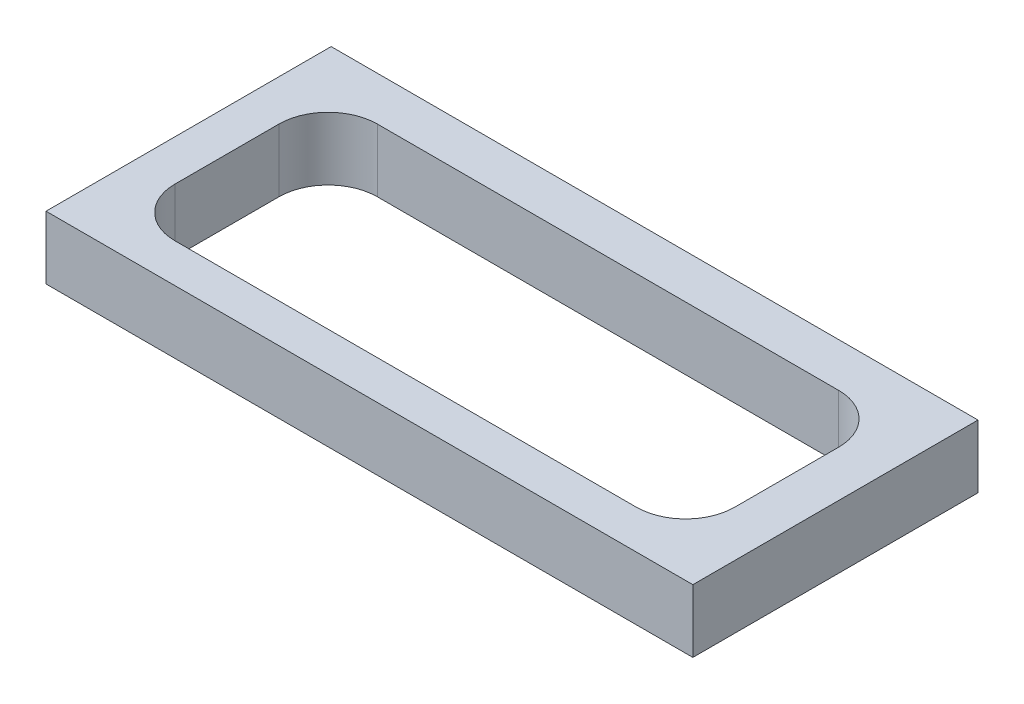
ISO-10303-21;
HEADER;
FILE_DESCRIPTION(('STEP AP214'),'2;1');
FILE_NAME('part.step','',(''),(''),'','','');
FILE_SCHEMA(('AUTOMOTIVE_DESIGN { 1 0 10303 214 1 1 1 1 }'));
ENDSEC;
DATA;
#1=APPLICATION_CONTEXT('core data for automotive mechanical design processes');
#2=APPLICATION_PROTOCOL_DEFINITION('international standard','automotive_design',2000,#1);
#3=PRODUCT_CONTEXT('',#1,'mechanical');
#4=PRODUCT('Part','Part','',(#3));
#5=PRODUCT_RELATED_PRODUCT_CATEGORY('part','',(#4));
#6=PRODUCT_DEFINITION_FORMATION('','',#4);
#7=PRODUCT_DEFINITION_CONTEXT('part definition',#1,'design');
#8=PRODUCT_DEFINITION('design','',#6,#7);
#9=PRODUCT_DEFINITION_SHAPE('','',#8);
#10=(LENGTH_UNIT() NAMED_UNIT(*) SI_UNIT(.MILLI.,.METRE.));
#11=(NAMED_UNIT(*) PLANE_ANGLE_UNIT() SI_UNIT($,.RADIAN.));
#12=(NAMED_UNIT(*) SI_UNIT($,.STERADIAN.) SOLID_ANGLE_UNIT());
#13=UNCERTAINTY_MEASURE_WITH_UNIT(LENGTH_MEASURE(1.E-05),#10,'distance_accuracy_value','');
#14=(GEOMETRIC_REPRESENTATION_CONTEXT(3) GLOBAL_UNCERTAINTY_ASSIGNED_CONTEXT((#13)) GLOBAL_UNIT_ASSIGNED_CONTEXT((#10,
#11,#12)) REPRESENTATION_CONTEXT('',''));
#15=CARTESIAN_POINT('',(0.,0.,0.));
#16=DIRECTION('',(0.,0.,1.));
#17=DIRECTION('',(1.,0.,0.));
#18=AXIS2_PLACEMENT_3D('',#15,#16,#17);
#19=CARTESIAN_POINT('',(0.,5.,0.));
#20=DIRECTION('',(0.,1.,0.));
#21=DIRECTION('',(0.,0.,1.));
#22=AXIS2_PLACEMENT_3D('',#19,#20,#21);
#23=PLANE('',#22);
#24=DIRECTION('',(0.,0.,1.));
#25=VECTOR('',#24,1.);
#26=CARTESIAN_POINT('',(-3.25088664137556,5.,-3.48837450157463));
#27=LINE('',#26,#25);
#28=CARTESIAN_POINT('',(-3.25088664137556,5.,-3.48837450157463));
#29=VERTEX_POINT('',#28);
#30=CARTESIAN_POINT('',(-3.25088664137556,5.,19.1312504378826));
#31=VERTEX_POINT('',#30);
#32=EDGE_CURVE('E194',#29,#31,#27,.T.);
#33=ORIENTED_EDGE('',*,*,#32,.T.);
#34=DIRECTION('',(1.,0.,0.));
#35=VECTOR('',#34,1.);
#36=CARTESIAN_POINT('',(-3.25088664137556,5.,19.1312504378826));
#37=LINE('',#36,#35);
#38=CARTESIAN_POINT('',(48.0616375085042,5.,19.1312504378826));
#39=VERTEX_POINT('',#38);
#40=EDGE_CURVE('E197',#31,#39,#37,.T.);
#41=ORIENTED_EDGE('',*,*,#40,.T.);
#42=DIRECTION('',(0.,0.,-1.));
#43=VECTOR('',#42,1.);
#44=CARTESIAN_POINT('',(48.0616375085042,5.,-3.48837450157463));
#45=LINE('',#44,#43);
#46=CARTESIAN_POINT('',(48.0616375085042,5.,-3.48837450157463));
#47=VERTEX_POINT('',#46);
#48=EDGE_CURVE('E196',#39,#47,#45,.T.);
#49=ORIENTED_EDGE('',*,*,#48,.T.);
#50=DIRECTION('',(-1.,0.,0.));
#51=VECTOR('',#50,1.);
#52=CARTESIAN_POINT('',(-3.25088664137556,5.,-3.48837450157463));
#53=LINE('',#52,#51);
#54=EDGE_CURVE('E202',#47,#29,#53,.T.);
#55=ORIENTED_EDGE('',*,*,#54,.T.);
#56=EDGE_LOOP('',(#33,#41,#49,#55));
#57=FACE_BOUND('',#56,.T.);
#58=DIRECTION('',(-1.,0.,0.));
#59=VECTOR('',#58,1.);
#60=CARTESIAN_POINT('',(3.9,5.,0.));
#61=LINE('',#60,#59);
#62=CARTESIAN_POINT('',(40.5,5.,0.));
#63=VERTEX_POINT('',#62);
#64=CARTESIAN_POINT('',(3.9,5.,0.));
#65=VERTEX_POINT('',#64);
#66=EDGE_CURVE('E136',#63,#65,#61,.T.);
#67=ORIENTED_EDGE('',*,*,#66,.F.);
#68=CARTESIAN_POINT('',(40.5,5.,3.9));
#69=DIRECTION('',(0.,1.,0.));
#70=DIRECTION('',(0.,0.,-1.));
#71=AXIS2_PLACEMENT_3D('',#68,#69,#70);
#72=CIRCLE('',#71,3.9);
#73=CARTESIAN_POINT('',(44.4,5.,3.9));
#74=VERTEX_POINT('',#73);
#75=EDGE_CURVE('E126',#74,#63,#72,.T.);
#76=ORIENTED_EDGE('',*,*,#75,.F.);
#77=DIRECTION('',(0.,0.,-1.));
#78=VECTOR('',#77,1.);
#79=CARTESIAN_POINT('',(44.4,5.,3.9));
#80=LINE('',#79,#78);
#81=CARTESIAN_POINT('',(44.4,5.,12.15));
#82=VERTEX_POINT('',#81);
#83=EDGE_CURVE('E162',#82,#74,#80,.T.);
#84=ORIENTED_EDGE('',*,*,#83,.F.);
#85=CARTESIAN_POINT('',(40.5,5.,12.15));
#86=DIRECTION('',(0.,1.,0.));
#87=DIRECTION('',(0.,0.,1.));
#88=AXIS2_PLACEMENT_3D('',#85,#86,#87);
#89=CIRCLE('',#88,3.9);
#90=CARTESIAN_POINT('',(40.5,5.,16.05));
#91=VERTEX_POINT('',#90);
#92=EDGE_CURVE('E159',#91,#82,#89,.T.);
#93=ORIENTED_EDGE('',*,*,#92,.F.);
#94=DIRECTION('',(1.,0.,0.));
#95=VECTOR('',#94,1.);
#96=CARTESIAN_POINT('',(3.9,5.,16.05));
#97=LINE('',#96,#95);
#98=CARTESIAN_POINT('',(3.9,5.,16.05));
#99=VERTEX_POINT('',#98);
#100=EDGE_CURVE('E160',#99,#91,#97,.T.);
#101=ORIENTED_EDGE('',*,*,#100,.F.);
#102=CARTESIAN_POINT('',(3.9,5.,12.15));
#103=DIRECTION('',(0.,1.,0.));
#104=DIRECTION('',(0.,0.,1.));
#105=AXIS2_PLACEMENT_3D('',#102,#103,#104);
#106=CIRCLE('',#105,3.9);
#107=CARTESIAN_POINT('',(0.,5.,12.15));
#108=VERTEX_POINT('',#107);
#109=EDGE_CURVE('E153',#108,#99,#106,.T.);
#110=ORIENTED_EDGE('',*,*,#109,.F.);
#111=DIRECTION('',(0.,0.,1.));
#112=VECTOR('',#111,1.);
#113=CARTESIAN_POINT('',(0.,5.,3.9));
#114=LINE('',#113,#112);
#115=CARTESIAN_POINT('',(0.,5.,3.9));
#116=VERTEX_POINT('',#115);
#117=EDGE_CURVE('E152',#116,#108,#114,.T.);
#118=ORIENTED_EDGE('',*,*,#117,.F.);
#119=CARTESIAN_POINT('',(3.9,5.,3.9));
#120=DIRECTION('',(0.,1.,0.));
#121=DIRECTION('',(0.,0.,1.));
#122=AXIS2_PLACEMENT_3D('',#119,#120,#121);
#123=CIRCLE('',#122,3.9);
#124=EDGE_CURVE('E146',#65,#116,#123,.T.);
#125=ORIENTED_EDGE('',*,*,#124,.F.);
#126=EDGE_LOOP('',(#67,#76,#84,#93,#101,#110,#118,#125));
#127=FACE_BOUND('',#126,.T.);
#128=ADVANCED_FACE('F39',(#57,#127),#23,.T.);
#129=CARTESIAN_POINT('',(0.,0.,0.));
#130=DIRECTION('',(0.,1.,0.));
#131=DIRECTION('',(0.,0.,1.));
#132=AXIS2_PLACEMENT_3D('',#129,#130,#131);
#133=PLANE('',#132);
#134=DIRECTION('',(0.,0.,1.));
#135=VECTOR('',#134,1.);
#136=CARTESIAN_POINT('',(-3.25088664137556,0.,-3.48837450157463));
#137=LINE('',#136,#135);
#138=CARTESIAN_POINT('',(-3.25088664137556,0.,-3.48837450157463));
#139=VERTEX_POINT('',#138);
#140=CARTESIAN_POINT('',(-3.25088664137556,0.,19.1312504378826));
#141=VERTEX_POINT('',#140);
#142=EDGE_CURVE('E143',#139,#141,#137,.T.);
#143=ORIENTED_EDGE('',*,*,#142,.F.);
#144=DIRECTION('',(-1.,0.,0.));
#145=VECTOR('',#144,1.);
#146=CARTESIAN_POINT('',(-3.25088664137556,0.,-3.48837450157463));
#147=LINE('',#146,#145);
#148=CARTESIAN_POINT('',(48.0616375085042,0.,-3.48837450157463));
#149=VERTEX_POINT('',#148);
#150=EDGE_CURVE('E199',#149,#139,#147,.T.);
#151=ORIENTED_EDGE('',*,*,#150,.F.);
#152=DIRECTION('',(0.,0.,-1.));
#153=VECTOR('',#152,1.);
#154=CARTESIAN_POINT('',(48.0616375085042,0.,-3.48837450157463));
#155=LINE('',#154,#153);
#156=CARTESIAN_POINT('',(48.0616375085042,0.,19.1312504378826));
#157=VERTEX_POINT('',#156);
#158=EDGE_CURVE('E210',#157,#149,#155,.T.);
#159=ORIENTED_EDGE('',*,*,#158,.F.);
#160=DIRECTION('',(1.,0.,0.));
#161=VECTOR('',#160,1.);
#162=CARTESIAN_POINT('',(-3.25088664137556,0.,19.1312504378826));
#163=LINE('',#162,#161);
#164=EDGE_CURVE('E207',#141,#157,#163,.T.);
#165=ORIENTED_EDGE('',*,*,#164,.F.);
#166=EDGE_LOOP('',(#143,#151,#159,#165));
#167=FACE_BOUND('',#166,.T.);
#168=CARTESIAN_POINT('',(40.5,0.,3.9));
#169=DIRECTION('',(0.,1.,0.));
#170=DIRECTION('',(0.,0.,-1.));
#171=AXIS2_PLACEMENT_3D('',#168,#169,#170);
#172=CIRCLE('',#171,3.9);
#173=CARTESIAN_POINT('',(44.4,0.,3.9));
#174=VERTEX_POINT('',#173);
#175=CARTESIAN_POINT('',(40.5,0.,0.));
#176=VERTEX_POINT('',#175);
#177=EDGE_CURVE('E64',#174,#176,#172,.T.);
#178=ORIENTED_EDGE('',*,*,#177,.T.);
#179=DIRECTION('',(-1.,0.,0.));
#180=VECTOR('',#179,1.);
#181=CARTESIAN_POINT('',(3.9,0.,0.));
#182=LINE('',#181,#180);
#183=CARTESIAN_POINT('',(3.9,0.,0.));
#184=VERTEX_POINT('',#183);
#185=EDGE_CURVE('E142',#176,#184,#182,.T.);
#186=ORIENTED_EDGE('',*,*,#185,.T.);
#187=CARTESIAN_POINT('',(3.9,0.,3.9));
#188=DIRECTION('',(0.,1.,0.));
#189=DIRECTION('',(0.,0.,1.));
#190=AXIS2_PLACEMENT_3D('',#187,#188,#189);
#191=CIRCLE('',#190,3.9);
#192=CARTESIAN_POINT('',(0.,0.,3.9));
#193=VERTEX_POINT('',#192);
#194=EDGE_CURVE('E163',#184,#193,#191,.T.);
#195=ORIENTED_EDGE('',*,*,#194,.T.);
#196=DIRECTION('',(0.,0.,1.));
#197=VECTOR('',#196,1.);
#198=CARTESIAN_POINT('',(0.,0.,3.9));
#199=LINE('',#198,#197);
#200=CARTESIAN_POINT('',(0.,0.,12.15));
#201=VERTEX_POINT('',#200);
#202=EDGE_CURVE('E166',#193,#201,#199,.T.);
#203=ORIENTED_EDGE('',*,*,#202,.T.);
#204=CARTESIAN_POINT('',(3.9,0.,12.15));
#205=DIRECTION('',(0.,1.,0.));
#206=DIRECTION('',(0.,0.,1.));
#207=AXIS2_PLACEMENT_3D('',#204,#205,#206);
#208=CIRCLE('',#207,3.9);
#209=CARTESIAN_POINT('',(3.9,0.,16.05));
#210=VERTEX_POINT('',#209);
#211=EDGE_CURVE('E173',#201,#210,#208,.T.);
#212=ORIENTED_EDGE('',*,*,#211,.T.);
#213=DIRECTION('',(1.,0.,0.));
#214=VECTOR('',#213,1.);
#215=CARTESIAN_POINT('',(3.9,0.,16.05));
#216=LINE('',#215,#214);
#217=CARTESIAN_POINT('',(40.5,0.,16.05));
#218=VERTEX_POINT('',#217);
#219=EDGE_CURVE('E174',#210,#218,#216,.T.);
#220=ORIENTED_EDGE('',*,*,#219,.T.);
#221=CARTESIAN_POINT('',(40.5,0.,12.15));
#222=DIRECTION('',(0.,1.,0.));
#223=DIRECTION('',(0.,0.,1.));
#224=AXIS2_PLACEMENT_3D('',#221,#222,#223);
#225=CIRCLE('',#224,3.9);
#226=CARTESIAN_POINT('',(44.4,0.,12.15));
#227=VERTEX_POINT('',#226);
#228=EDGE_CURVE('E180',#218,#227,#225,.T.);
#229=ORIENTED_EDGE('',*,*,#228,.T.);
#230=DIRECTION('',(0.,0.,-1.));
#231=VECTOR('',#230,1.);
#232=CARTESIAN_POINT('',(44.4,0.,3.9));
#233=LINE('',#232,#231);
#234=EDGE_CURVE('E140',#227,#174,#233,.T.);
#235=ORIENTED_EDGE('',*,*,#234,.T.);
#236=EDGE_LOOP('',(#178,#186,#195,#203,#212,#220,#229,#235));
#237=FACE_BOUND('',#236,.T.);
#238=ADVANCED_FACE('F226',(#167,#237),#133,.F.);
#239=CARTESIAN_POINT('',(-3.25088664137556,5.,-3.48837450157463));
#240=DIRECTION('',(1.,0.,0.));
#241=DIRECTION('',(0.,0.,-1.));
#242=AXIS2_PLACEMENT_3D('',#239,#240,#241);
#243=PLANE('',#242);
#244=ORIENTED_EDGE('',*,*,#142,.T.);
#245=DIRECTION('',(0.,-1.,0.));
#246=VECTOR('',#245,1.);
#247=CARTESIAN_POINT('',(-3.25088664137556,5.,19.1312504378826));
#248=LINE('',#247,#246);
#249=EDGE_CURVE('E11',#31,#141,#248,.T.);
#250=ORIENTED_EDGE('',*,*,#249,.F.);
#251=ORIENTED_EDGE('',*,*,#32,.F.);
#252=DIRECTION('',(0.,-1.,0.));
#253=VECTOR('',#252,1.);
#254=CARTESIAN_POINT('',(-3.25088664137556,5.,-3.48837450157463));
#255=LINE('',#254,#253);
#256=EDGE_CURVE('E201',#29,#139,#255,.T.);
#257=ORIENTED_EDGE('',*,*,#256,.T.);
#258=EDGE_LOOP('',(#244,#250,#251,#257));
#259=FACE_BOUND('',#258,.T.);
#260=ADVANCED_FACE('F41',(#259),#243,.F.);
#261=CARTESIAN_POINT('',(-3.25088664137556,5.,19.1312504378826));
#262=DIRECTION('',(0.,0.,-1.));
#263=DIRECTION('',(-1.,0.,0.));
#264=AXIS2_PLACEMENT_3D('',#261,#262,#263);
#265=PLANE('',#264);
#266=ORIENTED_EDGE('',*,*,#164,.T.);
#267=DIRECTION('',(0.,-1.,0.));
#268=VECTOR('',#267,1.);
#269=CARTESIAN_POINT('',(48.0616375085042,5.,19.1312504378826));
#270=LINE('',#269,#268);
#271=EDGE_CURVE('E50',#39,#157,#270,.T.);
#272=ORIENTED_EDGE('',*,*,#271,.F.);
#273=ORIENTED_EDGE('',*,*,#40,.F.);
#274=ORIENTED_EDGE('',*,*,#249,.T.);
#275=EDGE_LOOP('',(#266,#272,#273,#274));
#276=FACE_BOUND('',#275,.T.);
#277=ADVANCED_FACE('F237',(#276),#265,.F.);
#278=CARTESIAN_POINT('',(48.0616375085042,5.,-3.48837450157463));
#279=DIRECTION('',(-1.,0.,0.));
#280=DIRECTION('',(0.,0.,1.));
#281=AXIS2_PLACEMENT_3D('',#278,#279,#280);
#282=PLANE('',#281);
#283=ORIENTED_EDGE('',*,*,#158,.T.);
#284=DIRECTION('',(0.,-1.,0.));
#285=VECTOR('',#284,1.);
#286=CARTESIAN_POINT('',(48.0616375085042,5.,-3.48837450157463));
#287=LINE('',#286,#285);
#288=EDGE_CURVE('E211',#47,#149,#287,.T.);
#289=ORIENTED_EDGE('',*,*,#288,.F.);
#290=ORIENTED_EDGE('',*,*,#48,.F.);
#291=ORIENTED_EDGE('',*,*,#271,.T.);
#292=EDGE_LOOP('',(#283,#289,#290,#291));
#293=FACE_BOUND('',#292,.T.);
#294=ADVANCED_FACE('F217',(#293),#282,.F.);
#295=CARTESIAN_POINT('',(-3.25088664137556,5.,-3.48837450157463));
#296=DIRECTION('',(0.,0.,1.));
#297=DIRECTION('',(1.,0.,0.));
#298=AXIS2_PLACEMENT_3D('',#295,#296,#297);
#299=PLANE('',#298);
#300=ORIENTED_EDGE('',*,*,#150,.T.);
#301=ORIENTED_EDGE('',*,*,#256,.F.);
#302=ORIENTED_EDGE('',*,*,#54,.F.);
#303=ORIENTED_EDGE('',*,*,#288,.T.);
#304=EDGE_LOOP('',(#300,#301,#302,#303));
#305=FACE_BOUND('',#304,.T.);
#306=ADVANCED_FACE('F229',(#305),#299,.F.);
#307=CARTESIAN_POINT('',(40.5,5.,3.9));
#308=DIRECTION('',(0.,-1.,0.));
#309=DIRECTION('',(0.,0.,-1.));
#310=AXIS2_PLACEMENT_3D('',#307,#308,#309);
#311=CYLINDRICAL_SURFACE('',#310,3.9);
#312=ORIENTED_EDGE('',*,*,#177,.F.);
#313=DIRECTION('',(0.,-1.,0.));
#314=VECTOR('',#313,1.);
#315=CARTESIAN_POINT('',(44.4,5.,3.9));
#316=LINE('',#315,#314);
#317=EDGE_CURVE('E135',#74,#174,#316,.T.);
#318=ORIENTED_EDGE('',*,*,#317,.F.);
#319=ORIENTED_EDGE('',*,*,#75,.T.);
#320=DIRECTION('',(0.,-1.,0.));
#321=VECTOR('',#320,1.);
#322=CARTESIAN_POINT('',(40.5,5.,0.));
#323=LINE('',#322,#321);
#324=EDGE_CURVE('E131',#63,#176,#323,.T.);
#325=ORIENTED_EDGE('',*,*,#324,.T.);
#326=EDGE_LOOP('',(#312,#318,#319,#325));
#327=FACE_BOUND('',#326,.T.);
#328=ADVANCED_FACE('F127',(#327),#311,.F.);
#329=CARTESIAN_POINT('',(3.9,5.,0.));
#330=DIRECTION('',(0.,0.,1.));
#331=DIRECTION('',(1.,0.,0.));
#332=AXIS2_PLACEMENT_3D('',#329,#330,#331);
#333=PLANE('',#332);
#334=ORIENTED_EDGE('',*,*,#185,.F.);
#335=ORIENTED_EDGE('',*,*,#324,.F.);
#336=ORIENTED_EDGE('',*,*,#66,.T.);
#337=DIRECTION('',(0.,-1.,0.));
#338=VECTOR('',#337,1.);
#339=CARTESIAN_POINT('',(3.9,5.,0.));
#340=LINE('',#339,#338);
#341=EDGE_CURVE('E144',#65,#184,#340,.T.);
#342=ORIENTED_EDGE('',*,*,#341,.T.);
#343=EDGE_LOOP('',(#334,#335,#336,#342));
#344=FACE_BOUND('',#343,.T.);
#345=ADVANCED_FACE('F139',(#344),#333,.T.);
#346=CARTESIAN_POINT('',(3.9,5.,3.9));
#347=DIRECTION('',(0.,-1.,0.));
#348=DIRECTION('',(0.,0.,-1.));
#349=AXIS2_PLACEMENT_3D('',#346,#347,#348);
#350=CYLINDRICAL_SURFACE('',#349,3.9);
#351=ORIENTED_EDGE('',*,*,#194,.F.);
#352=ORIENTED_EDGE('',*,*,#341,.F.);
#353=ORIENTED_EDGE('',*,*,#124,.T.);
#354=DIRECTION('',(0.,-1.,0.));
#355=VECTOR('',#354,1.);
#356=CARTESIAN_POINT('',(0.,5.,3.9));
#357=LINE('',#356,#355);
#358=EDGE_CURVE('E189',#116,#193,#357,.T.);
#359=ORIENTED_EDGE('',*,*,#358,.T.);
#360=EDGE_LOOP('',(#351,#352,#353,#359));
#361=FACE_BOUND('',#360,.T.);
#362=ADVANCED_FACE('F260',(#361),#350,.F.);
#363=CARTESIAN_POINT('',(0.,5.,3.9));
#364=DIRECTION('',(1.,0.,0.));
#365=DIRECTION('',(0.,0.,-1.));
#366=AXIS2_PLACEMENT_3D('',#363,#364,#365);
#367=PLANE('',#366);
#368=ORIENTED_EDGE('',*,*,#202,.F.);
#369=ORIENTED_EDGE('',*,*,#358,.F.);
#370=ORIENTED_EDGE('',*,*,#117,.T.);
#371=DIRECTION('',(0.,-1.,0.));
#372=VECTOR('',#371,1.);
#373=CARTESIAN_POINT('',(0.,5.,12.15));
#374=LINE('',#373,#372);
#375=EDGE_CURVE('E187',#108,#201,#374,.T.);
#376=ORIENTED_EDGE('',*,*,#375,.T.);
#377=EDGE_LOOP('',(#368,#369,#370,#376));
#378=FACE_BOUND('',#377,.T.);
#379=ADVANCED_FACE('F261',(#378),#367,.T.);
#380=CARTESIAN_POINT('',(3.9,5.,12.15));
#381=DIRECTION('',(0.,-1.,0.));
#382=DIRECTION('',(0.,0.,-1.));
#383=AXIS2_PLACEMENT_3D('',#380,#381,#382);
#384=CYLINDRICAL_SURFACE('',#383,3.9);
#385=ORIENTED_EDGE('',*,*,#211,.F.);
#386=ORIENTED_EDGE('',*,*,#375,.F.);
#387=ORIENTED_EDGE('',*,*,#109,.T.);
#388=DIRECTION('',(0.,-1.,0.));
#389=VECTOR('',#388,1.);
#390=CARTESIAN_POINT('',(3.9,5.,16.05));
#391=LINE('',#390,#389);
#392=EDGE_CURVE('E186',#99,#210,#391,.T.);
#393=ORIENTED_EDGE('',*,*,#392,.T.);
#394=EDGE_LOOP('',(#385,#386,#387,#393));
#395=FACE_BOUND('',#394,.T.);
#396=ADVANCED_FACE('F267',(#395),#384,.F.);
#397=CARTESIAN_POINT('',(3.9,5.,16.05));
#398=DIRECTION('',(0.,0.,-1.));
#399=DIRECTION('',(-1.,0.,0.));
#400=AXIS2_PLACEMENT_3D('',#397,#398,#399);
#401=PLANE('',#400);
#402=ORIENTED_EDGE('',*,*,#219,.F.);
#403=ORIENTED_EDGE('',*,*,#392,.F.);
#404=ORIENTED_EDGE('',*,*,#100,.T.);
#405=DIRECTION('',(0.,-1.,0.));
#406=VECTOR('',#405,1.);
#407=CARTESIAN_POINT('',(40.5,5.,16.05));
#408=LINE('',#407,#406);
#409=EDGE_CURVE('E182',#91,#218,#408,.T.);
#410=ORIENTED_EDGE('',*,*,#409,.T.);
#411=EDGE_LOOP('',(#402,#403,#404,#410));
#412=FACE_BOUND('',#411,.T.);
#413=ADVANCED_FACE('F273',(#412),#401,.T.);
#414=CARTESIAN_POINT('',(40.5,5.,12.15));
#415=DIRECTION('',(0.,-1.,0.));
#416=DIRECTION('',(0.,0.,-1.));
#417=AXIS2_PLACEMENT_3D('',#414,#415,#416);
#418=CYLINDRICAL_SURFACE('',#417,3.9);
#419=ORIENTED_EDGE('',*,*,#228,.F.);
#420=ORIENTED_EDGE('',*,*,#409,.F.);
#421=ORIENTED_EDGE('',*,*,#92,.T.);
#422=DIRECTION('',(0.,-1.,0.));
#423=VECTOR('',#422,1.);
#424=CARTESIAN_POINT('',(44.4,5.,12.15));
#425=LINE('',#424,#423);
#426=EDGE_CURVE('E53',#82,#227,#425,.T.);
#427=ORIENTED_EDGE('',*,*,#426,.T.);
#428=EDGE_LOOP('',(#419,#420,#421,#427));
#429=FACE_BOUND('',#428,.T.);
#430=ADVANCED_FACE('F280',(#429),#418,.F.);
#431=CARTESIAN_POINT('',(44.4,5.,3.9));
#432=DIRECTION('',(-1.,0.,0.));
#433=DIRECTION('',(0.,0.,1.));
#434=AXIS2_PLACEMENT_3D('',#431,#432,#433);
#435=PLANE('',#434);
#436=ORIENTED_EDGE('',*,*,#234,.F.);
#437=ORIENTED_EDGE('',*,*,#426,.F.);
#438=ORIENTED_EDGE('',*,*,#83,.T.);
#439=ORIENTED_EDGE('',*,*,#317,.T.);
#440=EDGE_LOOP('',(#436,#437,#438,#439));
#441=FACE_BOUND('',#440,.T.);
#442=ADVANCED_FACE('F282',(#441),#435,.T.);
#443=CLOSED_SHELL('',(#128,#238,#260,#277,#294,#306,#328,#345,#362,#379,#396,#413,#430,#442));
#444=MANIFOLD_SOLID_BREP('B2',#443);
#445=ADVANCED_BREP_SHAPE_REPRESENTATION('',(#18,#444),#14);
#446=SHAPE_DEFINITION_REPRESENTATION(#9,#445);
ENDSEC;
END-ISO-10303-21;
